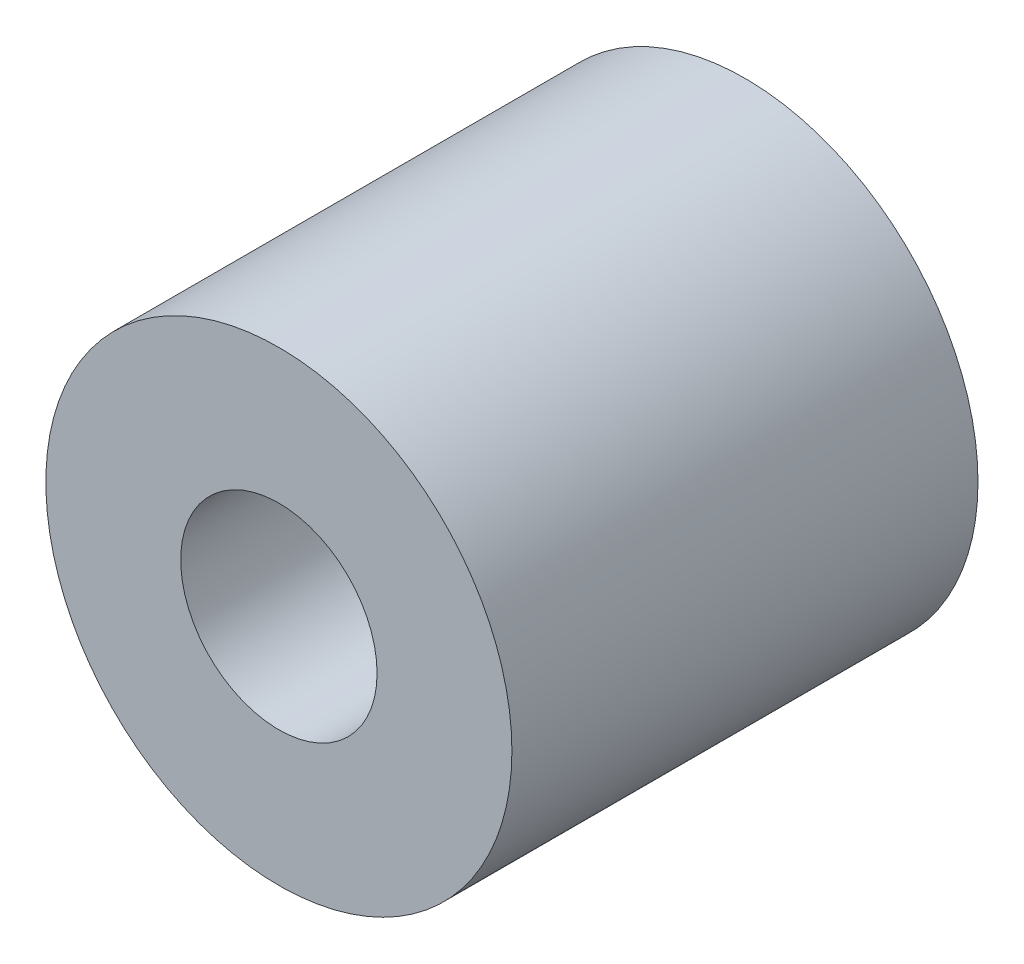
ISO-10303-21;
HEADER;
FILE_DESCRIPTION(('STEP AP214'),'2;1');
FILE_NAME('part.step','',(''),(''),'','','');
FILE_SCHEMA(('AUTOMOTIVE_DESIGN { 1 0 10303 214 1 1 1 1 }'));
ENDSEC;
DATA;
#1=APPLICATION_CONTEXT('core data for automotive mechanical design processes');
#2=APPLICATION_PROTOCOL_DEFINITION('international standard','automotive_design',2000,#1);
#3=PRODUCT_CONTEXT('',#1,'mechanical');
#4=PRODUCT('Part','Part','',(#3));
#5=PRODUCT_RELATED_PRODUCT_CATEGORY('part','',(#4));
#6=PRODUCT_DEFINITION_FORMATION('','',#4);
#7=PRODUCT_DEFINITION_CONTEXT('part definition',#1,'design');
#8=PRODUCT_DEFINITION('design','',#6,#7);
#9=PRODUCT_DEFINITION_SHAPE('','',#8);
#10=(LENGTH_UNIT() NAMED_UNIT(*) SI_UNIT(.MILLI.,.METRE.));
#11=(NAMED_UNIT(*) PLANE_ANGLE_UNIT() SI_UNIT($,.RADIAN.));
#12=(NAMED_UNIT(*) SI_UNIT($,.STERADIAN.) SOLID_ANGLE_UNIT());
#13=UNCERTAINTY_MEASURE_WITH_UNIT(LENGTH_MEASURE(1.E-05),#10,'distance_accuracy_value','');
#14=(GEOMETRIC_REPRESENTATION_CONTEXT(3) GLOBAL_UNCERTAINTY_ASSIGNED_CONTEXT((#13)) GLOBAL_UNIT_ASSIGNED_CONTEXT((#10,
#11,#12)) REPRESENTATION_CONTEXT('',''));
#15=CARTESIAN_POINT('',(0.,0.,0.));
#16=DIRECTION('',(0.,0.,1.));
#17=DIRECTION('',(1.,0.,0.));
#18=AXIS2_PLACEMENT_3D('',#15,#16,#17);
#19=CARTESIAN_POINT('',(113.005374880155,-113.005374880158,15.));
#20=DIRECTION('',(0.,0.,-1.));
#21=DIRECTION('',(-1.,0.,0.));
#22=AXIS2_PLACEMENT_3D('',#19,#20,#21);
#23=CYLINDRICAL_SURFACE('',#22,7.50000000000001);
#24=CARTESIAN_POINT('',(113.005374880155,-113.005374880158,15.));
#25=DIRECTION('',(0.,0.,1.));
#26=DIRECTION('',(1.,0.,0.));
#27=AXIS2_PLACEMENT_3D('',#24,#25,#26);
#28=CIRCLE('',#27,7.50000000000001);
#29=CARTESIAN_POINT('',(120.505374880155,-113.005374880158,15.));
#30=VERTEX_POINT('',#29);
#31=EDGE_CURVE('E10',#30,#30,#28,.T.);
#32=ORIENTED_EDGE('',*,*,#31,.F.);
#33=EDGE_LOOP('',(#32));
#34=FACE_BOUND('',#33,.T.);
#35=CARTESIAN_POINT('',(113.005374880155,-113.005374880158,0.));
#36=DIRECTION('',(0.,0.,1.));
#37=DIRECTION('',(1.,0.,0.));
#38=AXIS2_PLACEMENT_3D('',#35,#36,#37);
#39=CIRCLE('',#38,7.50000000000001);
#40=CARTESIAN_POINT('',(120.505374880155,-113.005374880158,0.));
#41=VERTEX_POINT('',#40);
#42=EDGE_CURVE('E36',#41,#41,#39,.T.);
#43=ORIENTED_EDGE('',*,*,#42,.T.);
#44=EDGE_LOOP('',(#43));
#45=FACE_BOUND('',#44,.T.);
#46=ADVANCED_FACE('F33',(#34,#45),#23,.T.);
#47=CARTESIAN_POINT('',(113.005374880155,-113.005374880158,15.));
#48=DIRECTION('',(0.,0.,1.));
#49=DIRECTION('',(1.,0.,0.));
#50=AXIS2_PLACEMENT_3D('',#47,#48,#49);
#51=PLANE('',#50);
#52=CARTESIAN_POINT('',(113.005374880155,-113.005374880158,15.));
#53=DIRECTION('',(0.,0.,1.));
#54=DIRECTION('',(1.,0.,0.));
#55=AXIS2_PLACEMENT_3D('',#52,#53,#54);
#56=CIRCLE('',#55,3.16001286571754);
#57=CARTESIAN_POINT('',(116.165387745873,-113.005374880158,15.));
#58=VERTEX_POINT('',#57);
#59=EDGE_CURVE('E45',#58,#58,#56,.T.);
#60=ORIENTED_EDGE('',*,*,#59,.F.);
#61=EDGE_LOOP('',(#60));
#62=FACE_BOUND('',#61,.T.);
#63=ORIENTED_EDGE('',*,*,#31,.T.);
#64=EDGE_LOOP('',(#63));
#65=FACE_BOUND('',#64,.T.);
#66=ADVANCED_FACE('F60',(#62,#65),#51,.T.);
#67=CARTESIAN_POINT('',(113.005374880155,-113.005374880158,0.));
#68=DIRECTION('',(0.,0.,1.));
#69=DIRECTION('',(1.,0.,0.));
#70=AXIS2_PLACEMENT_3D('',#67,#68,#69);
#71=PLANE('',#70);
#72=CARTESIAN_POINT('',(113.005374880155,-113.005374880158,0.));
#73=DIRECTION('',(0.,0.,1.));
#74=DIRECTION('',(1.,0.,0.));
#75=AXIS2_PLACEMENT_3D('',#72,#73,#74);
#76=CIRCLE('',#75,3.16001286571754);
#77=CARTESIAN_POINT('',(116.165387745873,-113.005374880158,0.));
#78=VERTEX_POINT('',#77);
#79=EDGE_CURVE('E43',#78,#78,#76,.T.);
#80=ORIENTED_EDGE('',*,*,#79,.T.);
#81=EDGE_LOOP('',(#80));
#82=FACE_BOUND('',#81,.T.);
#83=ORIENTED_EDGE('',*,*,#42,.F.);
#84=EDGE_LOOP('',(#83));
#85=FACE_BOUND('',#84,.T.);
#86=ADVANCED_FACE('F51',(#82,#85),#71,.F.);
#87=CARTESIAN_POINT('',(113.005374880155,-113.005374880158,0.));
#88=DIRECTION('',(0.,0.,1.));
#89=DIRECTION('',(1.,0.,0.));
#90=AXIS2_PLACEMENT_3D('',#87,#88,#89);
#91=CYLINDRICAL_SURFACE('',#90,3.16001286571754);
#92=ORIENTED_EDGE('',*,*,#79,.F.);
#93=EDGE_LOOP('',(#92));
#94=FACE_BOUND('',#93,.T.);
#95=ORIENTED_EDGE('',*,*,#59,.T.);
#96=EDGE_LOOP('',(#95));
#97=FACE_BOUND('',#96,.T.);
#98=ADVANCED_FACE('F54',(#94,#97),#91,.F.);
#99=CLOSED_SHELL('',(#46,#66,#86,#98));
#100=MANIFOLD_SOLID_BREP('B2',#99);
#101=ADVANCED_BREP_SHAPE_REPRESENTATION('',(#18,#100),#14);
#102=SHAPE_DEFINITION_REPRESENTATION(#9,#101);
ENDSEC;
END-ISO-10303-21;
